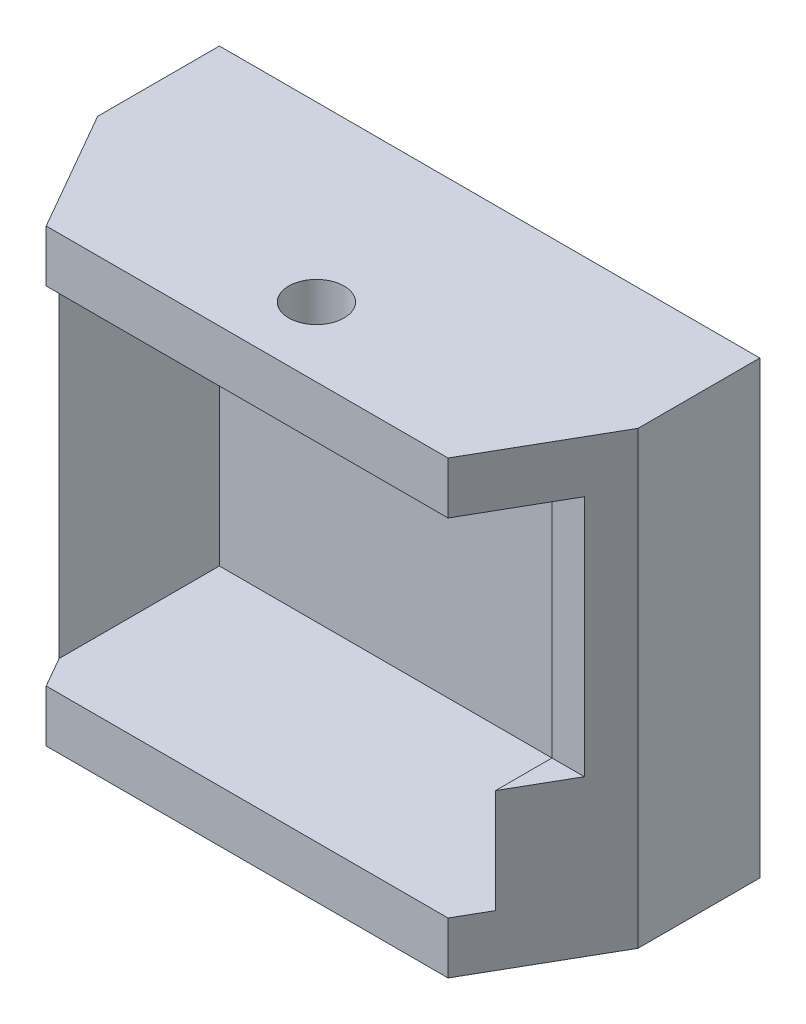
ISO-10303-21;
HEADER;
FILE_DESCRIPTION(('STEP AP214'),'2;1');
FILE_NAME('part.step','',(''),(''),'','','');
FILE_SCHEMA(('AUTOMOTIVE_DESIGN { 1 0 10303 214 1 1 1 1 }'));
ENDSEC;
DATA;
#1=APPLICATION_CONTEXT('core data for automotive mechanical design processes');
#2=APPLICATION_PROTOCOL_DEFINITION('international standard','automotive_design',2000,#1);
#3=PRODUCT_CONTEXT('',#1,'mechanical');
#4=PRODUCT('Part','Part','',(#3));
#5=PRODUCT_RELATED_PRODUCT_CATEGORY('part','',(#4));
#6=PRODUCT_DEFINITION_FORMATION('','',#4);
#7=PRODUCT_DEFINITION_CONTEXT('part definition',#1,'design');
#8=PRODUCT_DEFINITION('design','',#6,#7);
#9=PRODUCT_DEFINITION_SHAPE('','',#8);
#10=(LENGTH_UNIT() NAMED_UNIT(*) SI_UNIT(.MILLI.,.METRE.));
#11=(NAMED_UNIT(*) PLANE_ANGLE_UNIT() SI_UNIT($,.RADIAN.));
#12=(NAMED_UNIT(*) SI_UNIT($,.STERADIAN.) SOLID_ANGLE_UNIT());
#13=UNCERTAINTY_MEASURE_WITH_UNIT(LENGTH_MEASURE(1.E-05),#10,'distance_accuracy_value','');
#14=(GEOMETRIC_REPRESENTATION_CONTEXT(3) GLOBAL_UNCERTAINTY_ASSIGNED_CONTEXT((#13)) GLOBAL_UNIT_ASSIGNED_CONTEXT((#10,
#11,#12)) REPRESENTATION_CONTEXT('',''));
#15=CARTESIAN_POINT('',(0.,0.,0.));
#16=DIRECTION('',(0.,0.,1.));
#17=DIRECTION('',(1.,0.,0.));
#18=AXIS2_PLACEMENT_3D('',#15,#16,#17);
#19=CARTESIAN_POINT('',(-0.436133646871894,7.13054742664099,7.));
#20=DIRECTION('',(0.,-1.,0.));
#21=DIRECTION('',(0.,0.,-1.));
#22=AXIS2_PLACEMENT_3D('',#19,#20,#21);
#23=PLANE('',#22);
#24=DIRECTION('',(-1.,0.,0.));
#25=VECTOR('',#24,1.);
#26=CARTESIAN_POINT('',(-0.436133646871894,7.13054742664099,5.));
#27=LINE('',#26,#25);
#28=CARTESIAN_POINT('',(0.872267293743788,7.13054742664099,5.));
#29=VERTEX_POINT('',#28);
#30=CARTESIAN_POINT('',(-0.872267293743788,7.13054742664099,5.));
#31=VERTEX_POINT('',#30);
#32=EDGE_CURVE('E363',#29,#31,#27,.T.);
#33=ORIENTED_EDGE('',*,*,#32,.F.);
#34=DIRECTION('',(0.,0.,-1.));
#35=VECTOR('',#34,1.);
#36=CARTESIAN_POINT('',(0.872267293743788,7.13054742664099,7.));
#37=LINE('',#36,#35);
#38=CARTESIAN_POINT('',(0.872267293743788,7.13054742664099,7.));
#39=VERTEX_POINT('',#38);
#40=EDGE_CURVE('E12',#39,#29,#37,.T.);
#41=ORIENTED_EDGE('',*,*,#40,.F.);
#42=DIRECTION('',(-1.,0.,0.));
#43=VECTOR('',#42,1.);
#44=CARTESIAN_POINT('',(-0.436133646871894,7.13054742664099,7.));
#45=LINE('',#44,#43);
#46=CARTESIAN_POINT('',(-0.872267293743788,7.13054742664099,7.));
#47=VERTEX_POINT('',#46);
#48=EDGE_CURVE('E482',#39,#47,#45,.T.);
#49=ORIENTED_EDGE('',*,*,#48,.T.);
#50=DIRECTION('',(0.,0.,-1.));
#51=VECTOR('',#50,1.);
#52=CARTESIAN_POINT('',(-0.872267293743788,7.13054742664099,7.));
#53=LINE('',#52,#51);
#54=EDGE_CURVE('E322',#47,#31,#53,.T.);
#55=ORIENTED_EDGE('',*,*,#54,.T.);
#56=EDGE_LOOP('',(#33,#41,#49,#55));
#57=FACE_BOUND('',#56,.T.);
#58=ADVANCED_FACE('F20',(#57),#23,.T.);
#59=CARTESIAN_POINT('',(0.872267293743789,1.36932707391679,7.));
#60=DIRECTION('',(1.,0.,0.));
#61=DIRECTION('',(0.,1.,0.));
#62=AXIS2_PLACEMENT_3D('',#59,#60,#61);
#63=PLANE('',#62);
#64=DIRECTION('',(0.,0.,-1.));
#65=VECTOR('',#64,1.);
#66=CARTESIAN_POINT('',(0.872267293743789,-4.3918932788074,7.));
#67=LINE('',#66,#65);
#68=CARTESIAN_POINT('',(0.872267293743789,-4.3918932788074,7.));
#69=VERTEX_POINT('',#68);
#70=CARTESIAN_POINT('',(0.872267293743789,-4.3918932788074,5.));
#71=VERTEX_POINT('',#70);
#72=EDGE_CURVE('E31',#69,#71,#67,.T.);
#73=ORIENTED_EDGE('',*,*,#72,.F.);
#74=DIRECTION('',(0.,-1.,0.));
#75=VECTOR('',#74,1.);
#76=CARTESIAN_POINT('',(0.872267293743789,1.36932707391679,7.));
#77=LINE('',#76,#75);
#78=EDGE_CURVE('E485',#39,#69,#77,.T.);
#79=ORIENTED_EDGE('',*,*,#78,.F.);
#80=ORIENTED_EDGE('',*,*,#40,.T.);
#81=DIRECTION('',(0.,-1.,0.));
#82=VECTOR('',#81,1.);
#83=CARTESIAN_POINT('',(0.872267293743789,1.36932707391679,5.));
#84=LINE('',#83,#82);
#85=EDGE_CURVE('E308',#29,#71,#84,.T.);
#86=ORIENTED_EDGE('',*,*,#85,.T.);
#87=EDGE_LOOP('',(#73,#79,#80,#86));
#88=FACE_BOUND('',#87,.T.);
#89=ADVANCED_FACE('F431',(#88),#63,.F.);
#90=CARTESIAN_POINT('',(1.62186851957813,-4.39189327880741,7.));
#91=DIRECTION('',(0.,1.,0.));
#92=DIRECTION('',(1.,0.,0.));
#93=AXIS2_PLACEMENT_3D('',#90,#91,#92);
#94=PLANE('',#93);
#95=DIRECTION('',(0.,0.,-1.));
#96=VECTOR('',#95,1.);
#97=CARTESIAN_POINT('',(2.37146974541247,-4.39189327880741,7.));
#98=LINE('',#97,#96);
#99=CARTESIAN_POINT('',(2.37146974541247,-4.39189327880741,7.));
#100=VERTEX_POINT('',#99);
#101=CARTESIAN_POINT('',(2.37146974541247,-4.39189327880741,5.));
#102=VERTEX_POINT('',#101);
#103=EDGE_CURVE('E344',#100,#102,#98,.T.);
#104=ORIENTED_EDGE('',*,*,#103,.F.);
#105=DIRECTION('',(1.,0.,0.));
#106=VECTOR('',#105,1.);
#107=CARTESIAN_POINT('',(1.62186851957813,-4.39189327880741,7.));
#108=LINE('',#107,#106);
#109=EDGE_CURVE('E491',#69,#100,#108,.T.);
#110=ORIENTED_EDGE('',*,*,#109,.F.);
#111=ORIENTED_EDGE('',*,*,#72,.T.);
#112=DIRECTION('',(1.,0.,0.));
#113=VECTOR('',#112,1.);
#114=CARTESIAN_POINT('',(1.62186851957813,-4.39189327880741,5.));
#115=LINE('',#114,#113);
#116=EDGE_CURVE('E304',#71,#102,#115,.T.);
#117=ORIENTED_EDGE('',*,*,#116,.T.);
#118=EDGE_LOOP('',(#104,#110,#111,#117));
#119=FACE_BOUND('',#118,.T.);
#120=ADVANCED_FACE('F436',(#119),#94,.F.);
#121=CARTESIAN_POINT('',(1.18573487270624,-5.86967845447362,7.));
#122=DIRECTION('',(0.779965150098078,-0.625822949908744,0.));
#123=DIRECTION('',(0.,0.,-1.));
#124=AXIS2_PLACEMENT_3D('',#121,#122,#123);
#125=PLANE('',#124);
#126=DIRECTION('',(0.,0.,-1.));
#127=VECTOR('',#126,1.);
#128=CARTESIAN_POINT('',(0.,-7.34746363013984,7.));
#129=LINE('',#128,#127);
#130=CARTESIAN_POINT('',(0.,-7.34746363013984,7.));
#131=VERTEX_POINT('',#130);
#132=CARTESIAN_POINT('',(0.,-7.34746363013984,5.));
#133=VERTEX_POINT('',#132);
#134=EDGE_CURVE('E340',#131,#133,#129,.T.);
#135=ORIENTED_EDGE('',*,*,#134,.F.);
#136=DIRECTION('',(-0.625822949908744,-0.779965150098078,0.));
#137=VECTOR('',#136,1.);
#138=CARTESIAN_POINT('',(1.18573487270624,-5.86967845447362,7.));
#139=LINE('',#138,#137);
#140=EDGE_CURVE('E315',#100,#131,#139,.T.);
#141=ORIENTED_EDGE('',*,*,#140,.F.);
#142=ORIENTED_EDGE('',*,*,#103,.T.);
#143=DIRECTION('',(-0.625822949908744,-0.779965150098078,0.));
#144=VECTOR('',#143,1.);
#145=CARTESIAN_POINT('',(1.18573487270624,-5.86967845447362,5.));
#146=LINE('',#145,#144);
#147=EDGE_CURVE('E309',#102,#133,#146,.T.);
#148=ORIENTED_EDGE('',*,*,#147,.T.);
#149=EDGE_LOOP('',(#135,#141,#142,#148));
#150=FACE_BOUND('',#149,.T.);
#151=ADVANCED_FACE('F543',(#150),#125,.F.);
#152=CARTESIAN_POINT('',(-1.18573487270624,-5.86967845447362,7.));
#153=DIRECTION('',(0.779965150098078,0.625822949908744,0.));
#154=DIRECTION('',(0.,0.,-1.));
#155=AXIS2_PLACEMENT_3D('',#152,#153,#154);
#156=PLANE('',#155);
#157=DIRECTION('',(0.625822949908744,-0.779965150098078,0.));
#158=VECTOR('',#157,1.);
#159=CARTESIAN_POINT('',(-1.18573487270624,-5.86967845447362,5.));
#160=LINE('',#159,#158);
#161=CARTESIAN_POINT('',(-2.37146974541247,-4.3918932788074,5.));
#162=VERTEX_POINT('',#161);
#163=EDGE_CURVE('E356',#162,#133,#160,.T.);
#164=ORIENTED_EDGE('',*,*,#163,.F.);
#165=DIRECTION('',(0.,0.,-1.));
#166=VECTOR('',#165,1.);
#167=CARTESIAN_POINT('',(-2.37146974541247,-4.3918932788074,7.));
#168=LINE('',#167,#166);
#169=CARTESIAN_POINT('',(-2.37146974541247,-4.3918932788074,7.));
#170=VERTEX_POINT('',#169);
#171=EDGE_CURVE('E339',#170,#162,#168,.T.);
#172=ORIENTED_EDGE('',*,*,#171,.F.);
#173=DIRECTION('',(0.625822949908744,-0.779965150098078,0.));
#174=VECTOR('',#173,1.);
#175=CARTESIAN_POINT('',(-1.18573487270624,-5.86967845447362,7.));
#176=LINE('',#175,#174);
#177=EDGE_CURVE('E310',#170,#131,#176,.T.);
#178=ORIENTED_EDGE('',*,*,#177,.T.);
#179=ORIENTED_EDGE('',*,*,#134,.T.);
#180=EDGE_LOOP('',(#164,#172,#178,#179));
#181=FACE_BOUND('',#180,.T.);
#182=ADVANCED_FACE('F550',(#181),#156,.T.);
#183=CARTESIAN_POINT('',(-1.62186851957813,-4.3918932788074,7.));
#184=DIRECTION('',(0.,-1.,0.));
#185=DIRECTION('',(0.,0.,-1.));
#186=AXIS2_PLACEMENT_3D('',#183,#184,#185);
#187=PLANE('',#186);
#188=DIRECTION('',(-1.,0.,0.));
#189=VECTOR('',#188,1.);
#190=CARTESIAN_POINT('',(-1.62186851957813,-4.3918932788074,5.));
#191=LINE('',#190,#189);
#192=CARTESIAN_POINT('',(-0.872267293743789,-4.3918932788074,5.));
#193=VERTEX_POINT('',#192);
#194=EDGE_CURVE('E362',#193,#162,#191,.T.);
#195=ORIENTED_EDGE('',*,*,#194,.F.);
#196=DIRECTION('',(0.,0.,-1.));
#197=VECTOR('',#196,1.);
#198=CARTESIAN_POINT('',(-0.872267293743789,-4.3918932788074,7.));
#199=LINE('',#198,#197);
#200=CARTESIAN_POINT('',(-0.872267293743789,-4.3918932788074,7.));
#201=VERTEX_POINT('',#200);
#202=EDGE_CURVE('E45',#201,#193,#199,.T.);
#203=ORIENTED_EDGE('',*,*,#202,.F.);
#204=DIRECTION('',(-1.,0.,0.));
#205=VECTOR('',#204,1.);
#206=CARTESIAN_POINT('',(-1.62186851957813,-4.3918932788074,7.));
#207=LINE('',#206,#205);
#208=EDGE_CURVE('E314',#201,#170,#207,.T.);
#209=ORIENTED_EDGE('',*,*,#208,.T.);
#210=ORIENTED_EDGE('',*,*,#171,.T.);
#211=EDGE_LOOP('',(#195,#203,#209,#210));
#212=FACE_BOUND('',#211,.T.);
#213=ADVANCED_FACE('F477',(#212),#187,.T.);
#214=CARTESIAN_POINT('',(-0.872267293743788,1.36932707391679,7.));
#215=DIRECTION('',(1.,0.,0.));
#216=DIRECTION('',(0.,-1.,0.));
#217=AXIS2_PLACEMENT_3D('',#214,#215,#216);
#218=PLANE('',#217);
#219=DIRECTION('',(0.,-1.,0.));
#220=VECTOR('',#219,1.);
#221=CARTESIAN_POINT('',(-0.872267293743788,1.36932707391679,5.));
#222=LINE('',#221,#220);
#223=EDGE_CURVE('E554',#31,#193,#222,.T.);
#224=ORIENTED_EDGE('',*,*,#223,.F.);
#225=ORIENTED_EDGE('',*,*,#54,.F.);
#226=DIRECTION('',(0.,-1.,0.));
#227=VECTOR('',#226,1.);
#228=CARTESIAN_POINT('',(-0.872267293743788,1.36932707391679,7.));
#229=LINE('',#228,#227);
#230=EDGE_CURVE('E317',#47,#201,#229,.T.);
#231=ORIENTED_EDGE('',*,*,#230,.T.);
#232=ORIENTED_EDGE('',*,*,#202,.T.);
#233=EDGE_LOOP('',(#224,#225,#231,#232));
#234=FACE_BOUND('',#233,.T.);
#235=ADVANCED_FACE('F473',(#234),#218,.T.);
#236=CARTESIAN_POINT('',(0.,0.,7.));
#237=DIRECTION('',(0.,0.,-1.));
#238=DIRECTION('',(0.,-1.,0.));
#239=AXIS2_PLACEMENT_3D('',#236,#237,#238);
#240=PLANE('',#239);
#241=ORIENTED_EDGE('',*,*,#48,.F.);
#242=ORIENTED_EDGE('',*,*,#78,.T.);
#243=ORIENTED_EDGE('',*,*,#109,.T.);
#244=ORIENTED_EDGE('',*,*,#140,.T.);
#245=ORIENTED_EDGE('',*,*,#177,.F.);
#246=ORIENTED_EDGE('',*,*,#208,.F.);
#247=ORIENTED_EDGE('',*,*,#230,.F.);
#248=EDGE_LOOP('',(#241,#242,#243,#244,#245,#246,#247));
#249=FACE_BOUND('',#248,.T.);
#250=ADVANCED_FACE('F451',(#249),#240,.T.);
#251=CARTESIAN_POINT('',(0.,0.,5.));
#252=DIRECTION('',(0.,0.,1.));
#253=DIRECTION('',(1.,0.,0.));
#254=AXIS2_PLACEMENT_3D('',#251,#252,#253);
#255=PLANE('',#254);
#256=ORIENTED_EDGE('',*,*,#32,.T.);
#257=ORIENTED_EDGE('',*,*,#223,.T.);
#258=ORIENTED_EDGE('',*,*,#194,.T.);
#259=ORIENTED_EDGE('',*,*,#163,.T.);
#260=ORIENTED_EDGE('',*,*,#147,.F.);
#261=ORIENTED_EDGE('',*,*,#116,.F.);
#262=ORIENTED_EDGE('',*,*,#85,.F.);
#263=EDGE_LOOP('',(#256,#257,#258,#259,#260,#261,#262));
#264=FACE_BOUND('',#263,.T.);
#265=DIRECTION('',(0.,-1.,0.));
#266=VECTOR('',#265,1.);
#267=CARTESIAN_POINT('',(15.6,0.,5.));
#268=LINE('',#267,#266);
#269=CARTESIAN_POINT('',(15.6,13.,5.));
#270=VERTEX_POINT('',#269);
#271=CARTESIAN_POINT('',(15.6,-13.,5.));
#272=VERTEX_POINT('',#271);
#273=EDGE_CURVE('E245',#270,#272,#268,.T.);
#274=ORIENTED_EDGE('',*,*,#273,.T.);
#275=DIRECTION('',(-1.,0.,0.));
#276=VECTOR('',#275,1.);
#277=CARTESIAN_POINT('',(0.,-13.,5.));
#278=LINE('',#277,#276);
#279=CARTESIAN_POINT('',(-15.6,-13.,5.));
#280=VERTEX_POINT('',#279);
#281=EDGE_CURVE('E238',#272,#280,#278,.T.);
#282=ORIENTED_EDGE('',*,*,#281,.T.);
#283=DIRECTION('',(0.,-1.,0.));
#284=VECTOR('',#283,1.);
#285=CARTESIAN_POINT('',(-15.6,0.,5.));
#286=LINE('',#285,#284);
#287=CARTESIAN_POINT('',(-15.6,13.,5.));
#288=VERTEX_POINT('',#287);
#289=EDGE_CURVE('E219',#288,#280,#286,.T.);
#290=ORIENTED_EDGE('',*,*,#289,.F.);
#291=DIRECTION('',(-1.,0.,0.));
#292=VECTOR('',#291,1.);
#293=CARTESIAN_POINT('',(0.,13.,5.));
#294=LINE('',#293,#292);
#295=EDGE_CURVE('E281',#270,#288,#294,.T.);
#296=ORIENTED_EDGE('',*,*,#295,.F.);
#297=EDGE_LOOP('',(#274,#282,#290,#296));
#298=FACE_BOUND('',#297,.T.);
#299=ADVANCED_FACE('F244',(#264,#298),#255,.F.);
#300=CARTESIAN_POINT('',(0.,0.,11.5));
#301=DIRECTION('',(0.,0.,1.));
#302=DIRECTION('',(1.,0.,0.));
#303=AXIS2_PLACEMENT_3D('',#300,#301,#302);
#304=PLANE('',#303);
#305=DIRECTION('',(0.,1.,0.));
#306=VECTOR('',#305,1.);
#307=CARTESIAN_POINT('',(-12.6,0.,11.5));
#308=LINE('',#307,#306);
#309=CARTESIAN_POINT('',(-12.6,8.,11.5));
#310=VERTEX_POINT('',#309);
#311=CARTESIAN_POINT('',(-12.6,10.,11.5));
#312=VERTEX_POINT('',#311);
#313=EDGE_CURVE('E524',#310,#312,#308,.T.);
#314=ORIENTED_EDGE('',*,*,#313,.F.);
#315=DIRECTION('',(1.,0.,0.));
#316=VECTOR('',#315,1.);
#317=CARTESIAN_POINT('',(0.,8.,11.5));
#318=LINE('',#317,#316);
#319=CARTESIAN_POINT('',(12.6,8.,11.5));
#320=VERTEX_POINT('',#319);
#321=EDGE_CURVE('E390',#310,#320,#318,.T.);
#322=ORIENTED_EDGE('',*,*,#321,.T.);
#323=DIRECTION('',(0.,1.,0.));
#324=VECTOR('',#323,1.);
#325=CARTESIAN_POINT('',(12.6,0.,11.5));
#326=LINE('',#325,#324);
#327=CARTESIAN_POINT('',(12.6,10.,11.5));
#328=VERTEX_POINT('',#327);
#329=EDGE_CURVE('E515',#320,#328,#326,.T.);
#330=ORIENTED_EDGE('',*,*,#329,.T.);
#331=DIRECTION('',(1.,0.,0.));
#332=VECTOR('',#331,1.);
#333=CARTESIAN_POINT('',(0.,10.,11.5));
#334=LINE('',#333,#332);
#335=EDGE_CURVE('E381',#312,#328,#334,.T.);
#336=ORIENTED_EDGE('',*,*,#335,.F.);
#337=EDGE_LOOP('',(#314,#322,#330,#336));
#338=FACE_BOUND('',#337,.T.);
#339=ADVANCED_FACE('F450',(#338),#304,.T.);
#340=CARTESIAN_POINT('',(0.,8.,11.5));
#341=DIRECTION('',(0.,1.,0.));
#342=DIRECTION('',(1.,0.,0.));
#343=AXIS2_PLACEMENT_3D('',#340,#341,#342);
#344=PLANE('',#343);
#345=DIRECTION('',(0.,0.,-1.));
#346=VECTOR('',#345,1.);
#347=CARTESIAN_POINT('',(-12.6,8.,11.5));
#348=LINE('',#347,#346);
#349=CARTESIAN_POINT('',(-12.6,8.,8.));
#350=VERTEX_POINT('',#349);
#351=EDGE_CURVE('E529',#310,#350,#348,.T.);
#352=ORIENTED_EDGE('',*,*,#351,.T.);
#353=DIRECTION('',(1.,0.,0.));
#354=VECTOR('',#353,1.);
#355=CARTESIAN_POINT('',(0.,8.,8.));
#356=LINE('',#355,#354);
#357=CARTESIAN_POINT('',(12.6,8.,8.));
#358=VERTEX_POINT('',#357);
#359=EDGE_CURVE('E336',#350,#358,#356,.T.);
#360=ORIENTED_EDGE('',*,*,#359,.T.);
#361=DIRECTION('',(0.,0.,-1.));
#362=VECTOR('',#361,1.);
#363=CARTESIAN_POINT('',(12.6,8.,11.5));
#364=LINE('',#363,#362);
#365=EDGE_CURVE('E406',#320,#358,#364,.T.);
#366=ORIENTED_EDGE('',*,*,#365,.F.);
#367=ORIENTED_EDGE('',*,*,#321,.F.);
#368=EDGE_LOOP('',(#352,#360,#366,#367));
#369=FACE_BOUND('',#368,.T.);
#370=ADVANCED_FACE('F466',(#369),#344,.F.);
#371=CARTESIAN_POINT('',(0.,0.,8.));
#372=DIRECTION('',(0.,0.,1.));
#373=DIRECTION('',(1.,0.,0.));
#374=AXIS2_PLACEMENT_3D('',#371,#372,#373);
#375=PLANE('',#374);
#376=ORIENTED_EDGE('',*,*,#359,.F.);
#377=DIRECTION('',(0.,1.,0.));
#378=VECTOR('',#377,1.);
#379=CARTESIAN_POINT('',(-12.6,0.,8.));
#380=LINE('',#379,#378);
#381=CARTESIAN_POINT('',(-12.6,-10.,8.));
#382=VERTEX_POINT('',#381);
#383=EDGE_CURVE('E263',#382,#350,#380,.T.);
#384=ORIENTED_EDGE('',*,*,#383,.F.);
#385=DIRECTION('',(1.,0.,0.));
#386=VECTOR('',#385,1.);
#387=CARTESIAN_POINT('',(0.,-10.,8.));
#388=LINE('',#387,#386);
#389=CARTESIAN_POINT('',(12.6,-10.,8.));
#390=VERTEX_POINT('',#389);
#391=EDGE_CURVE('E365',#382,#390,#388,.T.);
#392=ORIENTED_EDGE('',*,*,#391,.T.);
#393=DIRECTION('',(0.,1.,0.));
#394=VECTOR('',#393,1.);
#395=CARTESIAN_POINT('',(12.6,0.,8.));
#396=LINE('',#395,#394);
#397=EDGE_CURVE('E403',#390,#358,#396,.T.);
#398=ORIENTED_EDGE('',*,*,#397,.T.);
#399=EDGE_LOOP('',(#376,#384,#392,#398));
#400=FACE_BOUND('',#399,.T.);
#401=ADVANCED_FACE('F442',(#400),#375,.T.);
#402=CARTESIAN_POINT('',(-13.5999409359423,-13.,15.5153705153549));
#403=DIRECTION('',(0.867306235334658,0.,-0.497774943272181));
#404=DIRECTION('',(0.,-1.,0.));
#405=AXIS2_PLACEMENT_3D('',#402,#403,#404);
#406=PLANE('',#405);
#407=DIRECTION('',(0.497774943272181,0.,0.867306235334658));
#408=VECTOR('',#407,1.);
#409=CARTESIAN_POINT('',(-8.72575322786438,10.,24.0079904202825));
#410=LINE('',#409,#408);
#411=CARTESIAN_POINT('',(-12.6,10.,17.2576338020687));
#412=VERTEX_POINT('',#411);
#413=CARTESIAN_POINT('',(-11.5999999999749,10.,19.));
#414=VERTEX_POINT('',#413);
#415=EDGE_CURVE('E370',#412,#414,#410,.T.);
#416=ORIENTED_EDGE('',*,*,#415,.T.);
#417=DIRECTION('',(0.,1.,0.));
#418=VECTOR('',#417,1.);
#419=CARTESIAN_POINT('',(-11.5999999999749,-13.,19.));
#420=LINE('',#419,#418);
#421=CARTESIAN_POINT('',(-11.5999999999749,13.,19.));
#422=VERTEX_POINT('',#421);
#423=EDGE_CURVE('E283',#414,#422,#420,.T.);
#424=ORIENTED_EDGE('',*,*,#423,.T.);
#425=DIRECTION('',(-0.497774943272181,0.,-0.867306235334658));
#426=VECTOR('',#425,1.);
#427=CARTESIAN_POINT('',(-13.5999409359423,13.,15.5153705153549));
#428=LINE('',#427,#426);
#429=CARTESIAN_POINT('',(-15.6,13.,12.0305352082745));
#430=VERTEX_POINT('',#429);
#431=EDGE_CURVE('E258',#422,#430,#428,.T.);
#432=ORIENTED_EDGE('',*,*,#431,.T.);
#433=DIRECTION('',(0.,1.,0.));
#434=VECTOR('',#433,1.);
#435=CARTESIAN_POINT('',(-15.6,0.,12.0305352082745));
#436=LINE('',#435,#434);
#437=CARTESIAN_POINT('',(-15.6,-13.,12.0305352082745));
#438=VERTEX_POINT('',#437);
#439=EDGE_CURVE('E231',#438,#430,#436,.T.);
#440=ORIENTED_EDGE('',*,*,#439,.F.);
#441=DIRECTION('',(-0.497774943272181,0.,-0.867306235334658));
#442=VECTOR('',#441,1.);
#443=CARTESIAN_POINT('',(-13.5999409359423,-13.,15.5153705153549));
#444=LINE('',#443,#442);
#445=CARTESIAN_POINT('',(-11.5999999999749,-13.,19.));
#446=VERTEX_POINT('',#445);
#447=EDGE_CURVE('E240',#446,#438,#444,.T.);
#448=ORIENTED_EDGE('',*,*,#447,.F.);
#449=DIRECTION('',(0.,1.,0.));
#450=VECTOR('',#449,1.);
#451=CARTESIAN_POINT('',(-11.5999999999749,-13.,19.));
#452=LINE('',#451,#450);
#453=CARTESIAN_POINT('',(-11.5999999999749,-10.,19.));
#454=VERTEX_POINT('',#453);
#455=EDGE_CURVE('E383',#446,#454,#452,.T.);
#456=ORIENTED_EDGE('',*,*,#455,.T.);
#457=DIRECTION('',(0.497774943272181,0.,0.867306235334658));
#458=VECTOR('',#457,1.);
#459=CARTESIAN_POINT('',(-8.72575322786438,-10.,24.0079904202825));
#460=LINE('',#459,#458);
#461=CARTESIAN_POINT('',(-12.6,-10.,17.2576338020686));
#462=VERTEX_POINT('',#461);
#463=EDGE_CURVE('E578',#462,#454,#460,.T.);
#464=ORIENTED_EDGE('',*,*,#463,.F.);
#465=DIRECTION('',(0.,1.,0.));
#466=VECTOR('',#465,1.);
#467=CARTESIAN_POINT('',(-12.6,0.,17.2576338020686));
#468=LINE('',#467,#466);
#469=EDGE_CURVE('E528',#462,#412,#468,.T.);
#470=ORIENTED_EDGE('',*,*,#469,.T.);
#471=EDGE_LOOP('',(#416,#424,#432,#440,#448,#456,#464,#470));
#472=FACE_BOUND('',#471,.T.);
#473=ADVANCED_FACE('F425',(#472),#406,.F.);
#474=CARTESIAN_POINT('',(13.5999409359423,-13.,15.5153705153549));
#475=DIRECTION('',(0.867306235334658,0.,0.497774943272181));
#476=DIRECTION('',(0.,-1.,0.));
#477=AXIS2_PLACEMENT_3D('',#474,#475,#476);
#478=PLANE('',#477);
#479=DIRECTION('',(-0.497774943272181,0.,0.867306235334658));
#480=VECTOR('',#479,1.);
#481=CARTESIAN_POINT('',(8.72575322786438,-10.,24.0079904202825));
#482=LINE('',#481,#480);
#483=CARTESIAN_POINT('',(12.6,-10.,17.2576338020687));
#484=VERTEX_POINT('',#483);
#485=CARTESIAN_POINT('',(11.5999999999749,-10.,19.));
#486=VERTEX_POINT('',#485);
#487=EDGE_CURVE('E582',#484,#486,#482,.T.);
#488=ORIENTED_EDGE('',*,*,#487,.T.);
#489=DIRECTION('',(0.,1.,0.));
#490=VECTOR('',#489,1.);
#491=CARTESIAN_POINT('',(11.5999999999749,-13.,19.));
#492=LINE('',#491,#490);
#493=CARTESIAN_POINT('',(11.5999999999749,-13.,19.));
#494=VERTEX_POINT('',#493);
#495=EDGE_CURVE('E571',#494,#486,#492,.T.);
#496=ORIENTED_EDGE('',*,*,#495,.F.);
#497=DIRECTION('',(0.497774943272181,0.,-0.867306235334658));
#498=VECTOR('',#497,1.);
#499=CARTESIAN_POINT('',(13.5999409359423,-13.,15.5153705153549));
#500=LINE('',#499,#498);
#501=CARTESIAN_POINT('',(15.6,-13.,12.0305352082745));
#502=VERTEX_POINT('',#501);
#503=EDGE_CURVE('E255',#494,#502,#500,.T.);
#504=ORIENTED_EDGE('',*,*,#503,.T.);
#505=DIRECTION('',(0.,1.,0.));
#506=VECTOR('',#505,1.);
#507=CARTESIAN_POINT('',(15.6,-13.,12.0305352082745));
#508=LINE('',#507,#506);
#509=CARTESIAN_POINT('',(15.6,13.,12.0305352082745));
#510=VERTEX_POINT('',#509);
#511=EDGE_CURVE('E232',#502,#510,#508,.T.);
#512=ORIENTED_EDGE('',*,*,#511,.T.);
#513=DIRECTION('',(0.497774943272181,0.,-0.867306235334658));
#514=VECTOR('',#513,1.);
#515=CARTESIAN_POINT('',(13.5999409359423,13.,15.5153705153549));
#516=LINE('',#515,#514);
#517=CARTESIAN_POINT('',(11.5999999999749,13.,19.));
#518=VERTEX_POINT('',#517);
#519=EDGE_CURVE('E249',#518,#510,#516,.T.);
#520=ORIENTED_EDGE('',*,*,#519,.F.);
#521=DIRECTION('',(0.,1.,0.));
#522=VECTOR('',#521,1.);
#523=CARTESIAN_POINT('',(11.5999999999749,-13.,19.));
#524=LINE('',#523,#522);
#525=CARTESIAN_POINT('',(11.5999999999749,10.,19.));
#526=VERTEX_POINT('',#525);
#527=EDGE_CURVE('E535',#526,#518,#524,.T.);
#528=ORIENTED_EDGE('',*,*,#527,.F.);
#529=DIRECTION('',(-0.497774943272181,0.,0.867306235334658));
#530=VECTOR('',#529,1.);
#531=CARTESIAN_POINT('',(8.72575322786438,10.,24.0079904202825));
#532=LINE('',#531,#530);
#533=CARTESIAN_POINT('',(14.4696608129429,10.,14.));
#534=VERTEX_POINT('',#533);
#535=EDGE_CURVE('E519',#534,#526,#532,.T.);
#536=ORIENTED_EDGE('',*,*,#535,.F.);
#537=DIRECTION('',(0.,-1.,0.));
#538=VECTOR('',#537,1.);
#539=CARTESIAN_POINT('',(14.4696608129429,3.,14.));
#540=LINE('',#539,#538);
#541=CARTESIAN_POINT('',(14.4696608129429,-4.,14.));
#542=VERTEX_POINT('',#541);
#543=EDGE_CURVE('E297',#534,#542,#540,.T.);
#544=ORIENTED_EDGE('',*,*,#543,.T.);
#545=DIRECTION('',(-0.497774943272181,0.,0.867306235334658));
#546=VECTOR('',#545,1.);
#547=CARTESIAN_POINT('',(12.9270881743829,-4.,16.6877264232808));
#548=LINE('',#547,#546);
#549=CARTESIAN_POINT('',(12.6,-4.,17.2576338020686));
#550=VERTEX_POINT('',#549);
#551=EDGE_CURVE('E242',#542,#550,#548,.T.);
#552=ORIENTED_EDGE('',*,*,#551,.T.);
#553=DIRECTION('',(0.,-1.,0.));
#554=VECTOR('',#553,1.);
#555=CARTESIAN_POINT('',(12.6,0.,17.2576338020686));
#556=LINE('',#555,#554);
#557=EDGE_CURVE('E391',#550,#484,#556,.T.);
#558=ORIENTED_EDGE('',*,*,#557,.T.);
#559=EDGE_LOOP('',(#488,#496,#504,#512,#520,#528,#536,#544,#552,#558));
#560=FACE_BOUND('',#559,.T.);
#561=ADVANCED_FACE('F416',(#560),#478,.T.);
#562=CARTESIAN_POINT('',(0.,10.,15.));
#563=DIRECTION('',(0.,1.,0.));
#564=DIRECTION('',(0.,0.,1.));
#565=AXIS2_PLACEMENT_3D('',#562,#563,#564);
#566=CYLINDRICAL_SURFACE('',#565,1.6);
#567=CARTESIAN_POINT('',(0.,13.,15.));
#568=DIRECTION('',(0.,1.,0.));
#569=DIRECTION('',(0.,0.,1.));
#570=AXIS2_PLACEMENT_3D('',#567,#568,#569);
#571=CIRCLE('',#570,1.6);
#572=CARTESIAN_POINT('',(0.,13.,16.6));
#573=VERTEX_POINT('',#572);
#574=EDGE_CURVE('E282',#573,#573,#571,.T.);
#575=ORIENTED_EDGE('',*,*,#574,.T.);
#576=EDGE_LOOP('',(#575));
#577=FACE_BOUND('',#576,.T.);
#578=CARTESIAN_POINT('',(0.,10.,15.));
#579=DIRECTION('',(0.,1.,0.));
#580=DIRECTION('',(0.,0.,1.));
#581=AXIS2_PLACEMENT_3D('',#578,#579,#580);
#582=CIRCLE('',#581,1.6);
#583=CARTESIAN_POINT('',(0.,10.,16.6));
#584=VERTEX_POINT('',#583);
#585=EDGE_CURVE('E382',#584,#584,#582,.T.);
#586=ORIENTED_EDGE('',*,*,#585,.F.);
#587=EDGE_LOOP('',(#586));
#588=FACE_BOUND('',#587,.T.);
#589=ADVANCED_FACE('F414',(#577,#588),#566,.F.);
#590=CARTESIAN_POINT('',(-15.6,0.,5.));
#591=DIRECTION('',(1.,0.,0.));
#592=DIRECTION('',(0.,1.,0.));
#593=AXIS2_PLACEMENT_3D('',#590,#591,#592);
#594=PLANE('',#593);
#595=DIRECTION('',(0.,0.,-1.));
#596=VECTOR('',#595,1.);
#597=CARTESIAN_POINT('',(-15.6,13.,5.));
#598=LINE('',#597,#596);
#599=EDGE_CURVE('E225',#430,#288,#598,.T.);
#600=ORIENTED_EDGE('',*,*,#599,.T.);
#601=ORIENTED_EDGE('',*,*,#289,.T.);
#602=DIRECTION('',(0.,0.,-1.));
#603=VECTOR('',#602,1.);
#604=CARTESIAN_POINT('',(-15.6,-13.,5.));
#605=LINE('',#604,#603);
#606=EDGE_CURVE('E222',#438,#280,#605,.T.);
#607=ORIENTED_EDGE('',*,*,#606,.F.);
#608=ORIENTED_EDGE('',*,*,#439,.T.);
#609=EDGE_LOOP('',(#600,#601,#607,#608));
#610=FACE_BOUND('',#609,.T.);
#611=ADVANCED_FACE('F221',(#610),#594,.F.);
#612=CARTESIAN_POINT('',(15.6,0.,5.));
#613=DIRECTION('',(1.,0.,0.));
#614=DIRECTION('',(0.,1.,0.));
#615=AXIS2_PLACEMENT_3D('',#612,#613,#614);
#616=PLANE('',#615);
#617=ORIENTED_EDGE('',*,*,#273,.F.);
#618=DIRECTION('',(0.,0.,-1.));
#619=VECTOR('',#618,1.);
#620=CARTESIAN_POINT('',(15.6,13.,5.));
#621=LINE('',#620,#619);
#622=EDGE_CURVE('E275',#510,#270,#621,.T.);
#623=ORIENTED_EDGE('',*,*,#622,.F.);
#624=ORIENTED_EDGE('',*,*,#511,.F.);
#625=DIRECTION('',(0.,0.,-1.));
#626=VECTOR('',#625,1.);
#627=CARTESIAN_POINT('',(15.6,-13.,5.));
#628=LINE('',#627,#626);
#629=EDGE_CURVE('E248',#502,#272,#628,.T.);
#630=ORIENTED_EDGE('',*,*,#629,.T.);
#631=EDGE_LOOP('',(#617,#623,#624,#630));
#632=FACE_BOUND('',#631,.T.);
#633=ADVANCED_FACE('F423',(#632),#616,.T.);
#634=CARTESIAN_POINT('',(12.6,3.,14.));
#635=DIRECTION('',(0.,0.,-1.));
#636=DIRECTION('',(-1.,0.,0.));
#637=AXIS2_PLACEMENT_3D('',#634,#635,#636);
#638=PLANE('',#637);
#639=ORIENTED_EDGE('',*,*,#543,.F.);
#640=DIRECTION('',(1.,0.,0.));
#641=VECTOR('',#640,1.);
#642=CARTESIAN_POINT('',(12.6,10.,14.));
#643=LINE('',#642,#641);
#644=CARTESIAN_POINT('',(12.6,10.,14.));
#645=VERTEX_POINT('',#644);
#646=EDGE_CURVE('E516',#645,#534,#643,.T.);
#647=ORIENTED_EDGE('',*,*,#646,.F.);
#648=DIRECTION('',(0.,1.,0.));
#649=VECTOR('',#648,1.);
#650=CARTESIAN_POINT('',(12.6,3.,14.));
#651=LINE('',#650,#649);
#652=CARTESIAN_POINT('',(12.6,-4.,14.));
#653=VERTEX_POINT('',#652);
#654=EDGE_CURVE('E24',#653,#645,#651,.T.);
#655=ORIENTED_EDGE('',*,*,#654,.F.);
#656=DIRECTION('',(1.,0.,0.));
#657=VECTOR('',#656,1.);
#658=CARTESIAN_POINT('',(12.6,-4.,14.));
#659=LINE('',#658,#657);
#660=EDGE_CURVE('E301',#653,#542,#659,.T.);
#661=ORIENTED_EDGE('',*,*,#660,.T.);
#662=EDGE_LOOP('',(#639,#647,#655,#661));
#663=FACE_BOUND('',#662,.T.);
#664=ADVANCED_FACE('F447',(#663),#638,.F.);
#665=CARTESIAN_POINT('',(12.6,-4.,16.5));
#666=DIRECTION('',(0.,-1.,0.));
#667=DIRECTION('',(0.,0.,-1.));
#668=AXIS2_PLACEMENT_3D('',#665,#666,#667);
#669=PLANE('',#668);
#670=ORIENTED_EDGE('',*,*,#551,.F.);
#671=ORIENTED_EDGE('',*,*,#660,.F.);
#672=DIRECTION('',(0.,0.,-1.));
#673=VECTOR('',#672,1.);
#674=CARTESIAN_POINT('',(12.6,-4.,16.5));
#675=LINE('',#674,#673);
#676=EDGE_CURVE('E332',#550,#653,#675,.T.);
#677=ORIENTED_EDGE('',*,*,#676,.F.);
#678=EDGE_LOOP('',(#670,#671,#677));
#679=FACE_BOUND('',#678,.T.);
#680=ADVANCED_FACE('F444',(#679),#669,.F.);
#681=CARTESIAN_POINT('',(0.,-13.,5.));
#682=DIRECTION('',(0.,-1.,0.));
#683=DIRECTION('',(0.,0.,-1.));
#684=AXIS2_PLACEMENT_3D('',#681,#682,#683);
#685=PLANE('',#684);
#686=ORIENTED_EDGE('',*,*,#281,.F.);
#687=ORIENTED_EDGE('',*,*,#629,.F.);
#688=ORIENTED_EDGE('',*,*,#503,.F.);
#689=DIRECTION('',(-1.,0.,0.));
#690=VECTOR('',#689,1.);
#691=CARTESIAN_POINT('',(0.,-13.,19.));
#692=LINE('',#691,#690);
#693=EDGE_CURVE('E568',#494,#446,#692,.T.);
#694=ORIENTED_EDGE('',*,*,#693,.T.);
#695=ORIENTED_EDGE('',*,*,#447,.T.);
#696=ORIENTED_EDGE('',*,*,#606,.T.);
#697=EDGE_LOOP('',(#686,#687,#688,#694,#695,#696));
#698=FACE_BOUND('',#697,.T.);
#699=ADVANCED_FACE('F236',(#698),#685,.T.);
#700=CARTESIAN_POINT('',(0.,13.,5.));
#701=DIRECTION('',(0.,-1.,0.));
#702=DIRECTION('',(0.,0.,-1.));
#703=AXIS2_PLACEMENT_3D('',#700,#701,#702);
#704=PLANE('',#703);
#705=ORIENTED_EDGE('',*,*,#622,.T.);
#706=ORIENTED_EDGE('',*,*,#295,.T.);
#707=ORIENTED_EDGE('',*,*,#599,.F.);
#708=ORIENTED_EDGE('',*,*,#431,.F.);
#709=DIRECTION('',(-1.,0.,0.));
#710=VECTOR('',#709,1.);
#711=CARTESIAN_POINT('',(0.,13.,19.));
#712=LINE('',#711,#710);
#713=EDGE_CURVE('E287',#518,#422,#712,.T.);
#714=ORIENTED_EDGE('',*,*,#713,.F.);
#715=ORIENTED_EDGE('',*,*,#519,.T.);
#716=EDGE_LOOP('',(#705,#706,#707,#708,#714,#715));
#717=FACE_BOUND('',#716,.T.);
#718=ORIENTED_EDGE('',*,*,#574,.F.);
#719=EDGE_LOOP('',(#718));
#720=FACE_BOUND('',#719,.T.);
#721=ADVANCED_FACE('F22',(#717,#720),#704,.F.);
#722=CARTESIAN_POINT('',(0.,0.,19.));
#723=DIRECTION('',(0.,0.,1.));
#724=DIRECTION('',(1.,0.,0.));
#725=AXIS2_PLACEMENT_3D('',#722,#723,#724);
#726=PLANE('',#725);
#727=DIRECTION('',(-1.,0.,0.));
#728=VECTOR('',#727,1.);
#729=CARTESIAN_POINT('',(0.,10.,19.));
#730=LINE('',#729,#728);
#731=EDGE_CURVE('E402',#526,#414,#730,.T.);
#732=ORIENTED_EDGE('',*,*,#731,.F.);
#733=ORIENTED_EDGE('',*,*,#527,.T.);
#734=ORIENTED_EDGE('',*,*,#713,.T.);
#735=ORIENTED_EDGE('',*,*,#423,.F.);
#736=EDGE_LOOP('',(#732,#733,#734,#735));
#737=FACE_BOUND('',#736,.T.);
#738=ADVANCED_FACE('F459',(#737),#726,.T.);
#739=CARTESIAN_POINT('',(0.,0.,19.));
#740=DIRECTION('',(0.,0.,1.));
#741=DIRECTION('',(1.,0.,0.));
#742=AXIS2_PLACEMENT_3D('',#739,#740,#741);
#743=PLANE('',#742);
#744=ORIENTED_EDGE('',*,*,#693,.F.);
#745=ORIENTED_EDGE('',*,*,#495,.T.);
#746=DIRECTION('',(-1.,0.,0.));
#747=VECTOR('',#746,1.);
#748=CARTESIAN_POINT('',(0.,-10.,19.));
#749=LINE('',#748,#747);
#750=EDGE_CURVE('E590',#486,#454,#749,.T.);
#751=ORIENTED_EDGE('',*,*,#750,.T.);
#752=ORIENTED_EDGE('',*,*,#455,.F.);
#753=EDGE_LOOP('',(#744,#745,#751,#752));
#754=FACE_BOUND('',#753,.T.);
#755=ADVANCED_FACE('F462',(#754),#743,.T.);
#756=CARTESIAN_POINT('',(-12.6,0.,19.));
#757=DIRECTION('',(1.,0.,0.));
#758=DIRECTION('',(0.,-1.,0.));
#759=AXIS2_PLACEMENT_3D('',#756,#757,#758);
#760=PLANE('',#759);
#761=DIRECTION('',(0.,0.,-1.));
#762=VECTOR('',#761,1.);
#763=CARTESIAN_POINT('',(-12.6,-10.,19.));
#764=LINE('',#763,#762);
#765=EDGE_CURVE('E369',#462,#382,#764,.T.);
#766=ORIENTED_EDGE('',*,*,#765,.T.);
#767=ORIENTED_EDGE('',*,*,#383,.T.);
#768=ORIENTED_EDGE('',*,*,#351,.F.);
#769=ORIENTED_EDGE('',*,*,#313,.T.);
#770=DIRECTION('',(0.,0.,-1.));
#771=VECTOR('',#770,1.);
#772=CARTESIAN_POINT('',(-12.6,10.,19.));
#773=LINE('',#772,#771);
#774=EDGE_CURVE('E375',#412,#312,#773,.T.);
#775=ORIENTED_EDGE('',*,*,#774,.F.);
#776=ORIENTED_EDGE('',*,*,#469,.F.);
#777=EDGE_LOOP('',(#766,#767,#768,#769,#775,#776));
#778=FACE_BOUND('',#777,.T.);
#779=ADVANCED_FACE('F943',(#778),#760,.T.);
#780=CARTESIAN_POINT('',(12.6,0.,19.));
#781=DIRECTION('',(1.,0.,0.));
#782=DIRECTION('',(0.,-1.,0.));
#783=AXIS2_PLACEMENT_3D('',#780,#781,#782);
#784=PLANE('',#783);
#785=ORIENTED_EDGE('',*,*,#329,.F.);
#786=ORIENTED_EDGE('',*,*,#365,.T.);
#787=ORIENTED_EDGE('',*,*,#397,.F.);
#788=DIRECTION('',(0.,0.,-1.));
#789=VECTOR('',#788,1.);
#790=CARTESIAN_POINT('',(12.6,-10.,19.));
#791=LINE('',#790,#789);
#792=EDGE_CURVE('E579',#484,#390,#791,.T.);
#793=ORIENTED_EDGE('',*,*,#792,.F.);
#794=ORIENTED_EDGE('',*,*,#557,.F.);
#795=ORIENTED_EDGE('',*,*,#676,.T.);
#796=ORIENTED_EDGE('',*,*,#654,.T.);
#797=DIRECTION('',(0.,0.,-1.));
#798=VECTOR('',#797,1.);
#799=CARTESIAN_POINT('',(12.6,10.,19.));
#800=LINE('',#799,#798);
#801=EDGE_CURVE('E345',#645,#328,#800,.T.);
#802=ORIENTED_EDGE('',*,*,#801,.T.);
#803=EDGE_LOOP('',(#785,#786,#787,#793,#794,#795,#796,#802));
#804=FACE_BOUND('',#803,.T.);
#805=ADVANCED_FACE('F470',(#804),#784,.F.);
#806=CARTESIAN_POINT('',(0.,-10.,19.));
#807=DIRECTION('',(0.,-1.,0.));
#808=DIRECTION('',(0.,0.,-1.));
#809=AXIS2_PLACEMENT_3D('',#806,#807,#808);
#810=PLANE('',#809);
#811=ORIENTED_EDGE('',*,*,#391,.F.);
#812=ORIENTED_EDGE('',*,*,#765,.F.);
#813=ORIENTED_EDGE('',*,*,#463,.T.);
#814=ORIENTED_EDGE('',*,*,#750,.F.);
#815=ORIENTED_EDGE('',*,*,#487,.F.);
#816=ORIENTED_EDGE('',*,*,#792,.T.);
#817=EDGE_LOOP('',(#811,#812,#813,#814,#815,#816));
#818=FACE_BOUND('',#817,.T.);
#819=ADVANCED_FACE('F468',(#818),#810,.F.);
#820=CARTESIAN_POINT('',(0.,10.,19.));
#821=DIRECTION('',(0.,-1.,0.));
#822=DIRECTION('',(0.,0.,-1.));
#823=AXIS2_PLACEMENT_3D('',#820,#821,#822);
#824=PLANE('',#823);
#825=ORIENTED_EDGE('',*,*,#774,.T.);
#826=ORIENTED_EDGE('',*,*,#335,.T.);
#827=ORIENTED_EDGE('',*,*,#801,.F.);
#828=ORIENTED_EDGE('',*,*,#646,.T.);
#829=ORIENTED_EDGE('',*,*,#535,.T.);
#830=ORIENTED_EDGE('',*,*,#731,.T.);
#831=ORIENTED_EDGE('',*,*,#415,.F.);
#832=EDGE_LOOP('',(#825,#826,#827,#828,#829,#830,#831));
#833=FACE_BOUND('',#832,.T.);
#834=ORIENTED_EDGE('',*,*,#585,.T.);
#835=EDGE_LOOP('',(#834));
#836=FACE_BOUND('',#835,.T.);
#837=ADVANCED_FACE('F412',(#833,#836),#824,.T.);
#838=CLOSED_SHELL('',(#58,#89,#120,#151,#182,#213,#235,#250,#299,#339,#370,#401,#473,#561,#589,
#611,#633,#664,#680,#699,#721,#738,#755,#779,#805,#819,#837));
#839=MANIFOLD_SOLID_BREP('B1',#838);
#840=ADVANCED_BREP_SHAPE_REPRESENTATION('',(#18,#839),#14);
#841=SHAPE_DEFINITION_REPRESENTATION(#9,#840);
ENDSEC;
END-ISO-10303-21;
